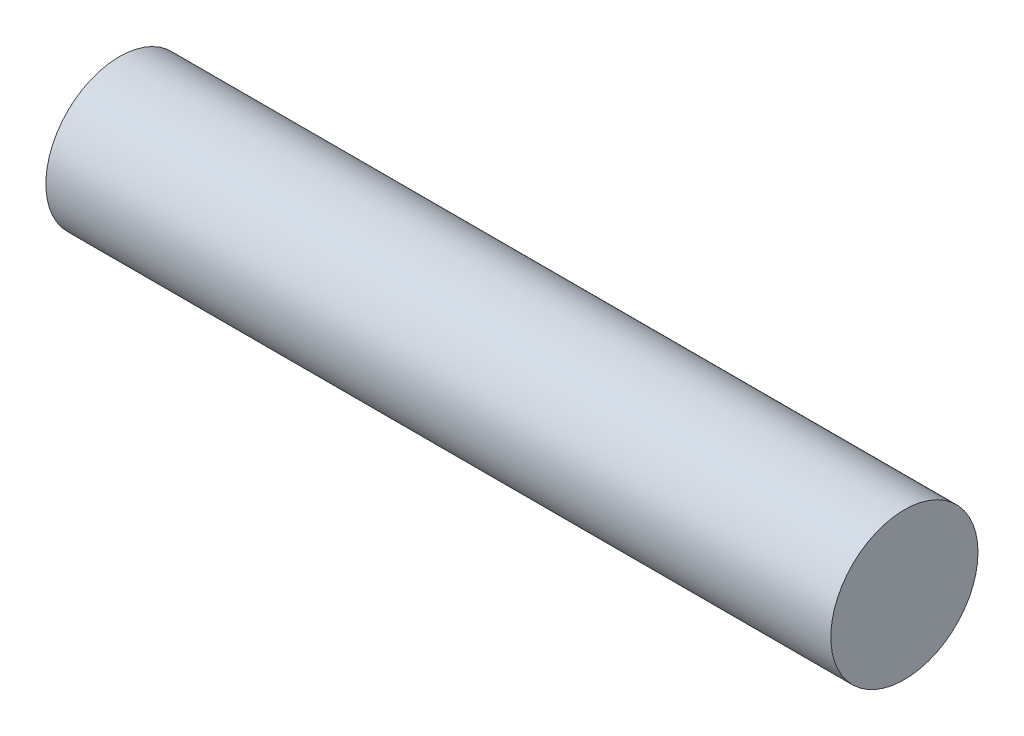
ISO-10303-21;
HEADER;
FILE_DESCRIPTION(('STEP AP214'),'2;1');
FILE_NAME('part.step','',(''),(''),'','','');
FILE_SCHEMA(('AUTOMOTIVE_DESIGN { 1 0 10303 214 1 1 1 1 }'));
ENDSEC;
DATA;
#1=APPLICATION_CONTEXT('core data for automotive mechanical design processes');
#2=APPLICATION_PROTOCOL_DEFINITION('international standard','automotive_design',2000,#1);
#3=PRODUCT_CONTEXT('',#1,'mechanical');
#4=PRODUCT('Part','Part','',(#3));
#5=PRODUCT_RELATED_PRODUCT_CATEGORY('part','',(#4));
#6=PRODUCT_DEFINITION_FORMATION('','',#4);
#7=PRODUCT_DEFINITION_CONTEXT('part definition',#1,'design');
#8=PRODUCT_DEFINITION('design','',#6,#7);
#9=PRODUCT_DEFINITION_SHAPE('','',#8);
#10=(LENGTH_UNIT() NAMED_UNIT(*) SI_UNIT(.MILLI.,.METRE.));
#11=(NAMED_UNIT(*) PLANE_ANGLE_UNIT() SI_UNIT($,.RADIAN.));
#12=(NAMED_UNIT(*) SI_UNIT($,.STERADIAN.) SOLID_ANGLE_UNIT());
#13=UNCERTAINTY_MEASURE_WITH_UNIT(LENGTH_MEASURE(1.E-05),#10,'distance_accuracy_value','');
#14=(GEOMETRIC_REPRESENTATION_CONTEXT(3) GLOBAL_UNCERTAINTY_ASSIGNED_CONTEXT((#13)) GLOBAL_UNIT_ASSIGNED_CONTEXT((#10,
#11,#12)) REPRESENTATION_CONTEXT('',''));
#15=CARTESIAN_POINT('',(0.,0.,0.));
#16=DIRECTION('',(0.,0.,1.));
#17=DIRECTION('',(1.,0.,0.));
#18=AXIS2_PLACEMENT_3D('',#15,#16,#17);
#19=CARTESIAN_POINT('',(25.4,0.,0.));
#20=DIRECTION('',(-1.,0.,0.));
#21=DIRECTION('',(0.,0.,1.));
#22=AXIS2_PLACEMENT_3D('',#19,#20,#21);
#23=CYLINDRICAL_SURFACE('',#22,2.38125);
#24=CARTESIAN_POINT('',(25.4,0.,0.));
#25=DIRECTION('',(1.,0.,0.));
#26=DIRECTION('',(0.,0.,-1.));
#27=AXIS2_PLACEMENT_3D('',#24,#25,#26);
#28=CIRCLE('',#27,2.38125);
#29=CARTESIAN_POINT('',(25.4,0.,-2.38125));
#30=VERTEX_POINT('',#29);
#31=EDGE_CURVE('E10',#30,#30,#28,.T.);
#32=ORIENTED_EDGE('',*,*,#31,.F.);
#33=EDGE_LOOP('',(#32));
#34=FACE_BOUND('',#33,.T.);
#35=CARTESIAN_POINT('',(0.,0.,0.));
#36=DIRECTION('',(1.,0.,0.));
#37=DIRECTION('',(0.,0.,-1.));
#38=AXIS2_PLACEMENT_3D('',#35,#36,#37);
#39=CIRCLE('',#38,2.38125);
#40=CARTESIAN_POINT('',(0.,0.,-2.38125));
#41=VERTEX_POINT('',#40);
#42=EDGE_CURVE('E36',#41,#41,#39,.T.);
#43=ORIENTED_EDGE('',*,*,#42,.T.);
#44=EDGE_LOOP('',(#43));
#45=FACE_BOUND('',#44,.T.);
#46=ADVANCED_FACE('F33',(#34,#45),#23,.T.);
#47=CARTESIAN_POINT('',(25.4,0.,0.));
#48=DIRECTION('',(1.,0.,0.));
#49=DIRECTION('',(0.,0.,-1.));
#50=AXIS2_PLACEMENT_3D('',#47,#48,#49);
#51=PLANE('',#50);
#52=ORIENTED_EDGE('',*,*,#31,.T.);
#53=EDGE_LOOP('',(#52));
#54=FACE_BOUND('',#53,.T.);
#55=ADVANCED_FACE('F48',(#54),#51,.T.);
#56=CARTESIAN_POINT('',(0.,0.,0.));
#57=DIRECTION('',(1.,0.,0.));
#58=DIRECTION('',(0.,0.,-1.));
#59=AXIS2_PLACEMENT_3D('',#56,#57,#58);
#60=PLANE('',#59);
#61=ORIENTED_EDGE('',*,*,#42,.F.);
#62=EDGE_LOOP('',(#61));
#63=FACE_BOUND('',#62,.T.);
#64=ADVANCED_FACE('F46',(#63),#60,.F.);
#65=CLOSED_SHELL('',(#46,#55,#64));
#66=MANIFOLD_SOLID_BREP('B2',#65);
#67=ADVANCED_BREP_SHAPE_REPRESENTATION('',(#18,#66),#14);
#68=SHAPE_DEFINITION_REPRESENTATION(#9,#67);
ENDSEC;
END-ISO-10303-21;
